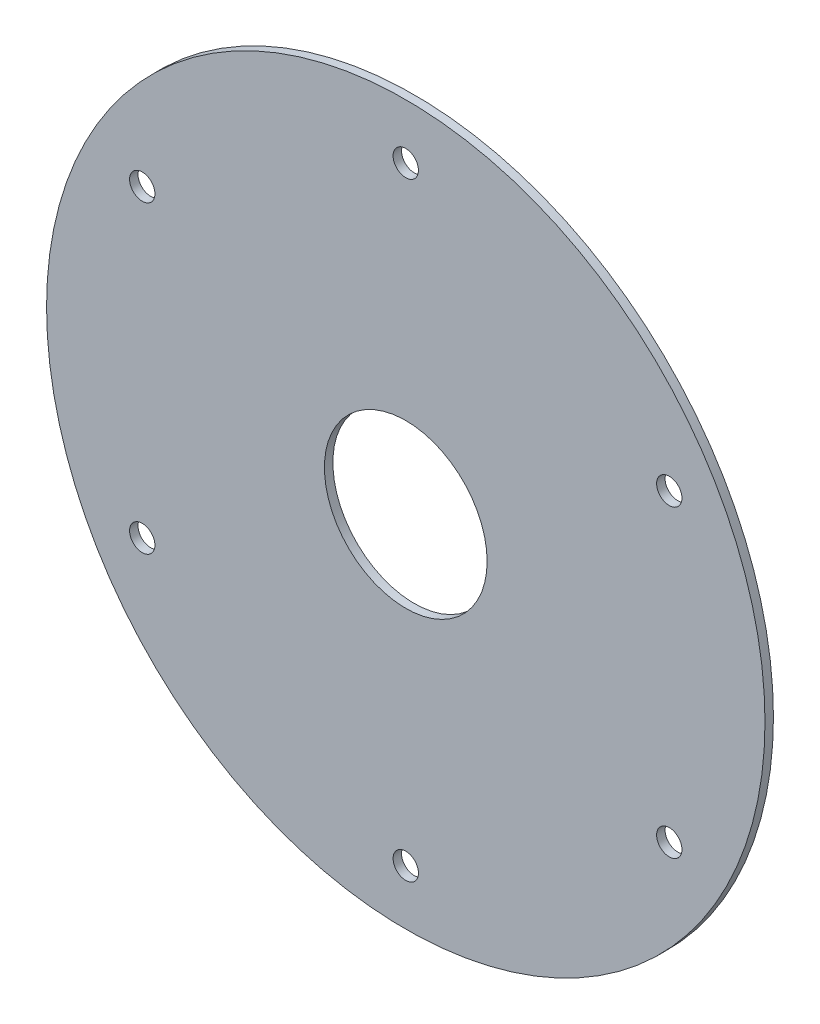
ISO-10303-21;
HEADER;
FILE_DESCRIPTION(('STEP AP214'),'2;1');
FILE_NAME('part.step','',(''),(''),'','','');
FILE_SCHEMA(('AUTOMOTIVE_DESIGN { 1 0 10303 214 1 1 1 1 }'));
ENDSEC;
DATA;
#1=APPLICATION_CONTEXT('core data for automotive mechanical design processes');
#2=APPLICATION_PROTOCOL_DEFINITION('international standard','automotive_design',2000,#1);
#3=PRODUCT_CONTEXT('',#1,'mechanical');
#4=PRODUCT('Part','Part','',(#3));
#5=PRODUCT_RELATED_PRODUCT_CATEGORY('part','',(#4));
#6=PRODUCT_DEFINITION_FORMATION('','',#4);
#7=PRODUCT_DEFINITION_CONTEXT('part definition',#1,'design');
#8=PRODUCT_DEFINITION('design','',#6,#7);
#9=PRODUCT_DEFINITION_SHAPE('','',#8);
#10=(LENGTH_UNIT() NAMED_UNIT(*) SI_UNIT(.MILLI.,.METRE.));
#11=(NAMED_UNIT(*) PLANE_ANGLE_UNIT() SI_UNIT($,.RADIAN.));
#12=(NAMED_UNIT(*) SI_UNIT($,.STERADIAN.) SOLID_ANGLE_UNIT());
#13=UNCERTAINTY_MEASURE_WITH_UNIT(LENGTH_MEASURE(1.E-05),#10,'distance_accuracy_value','');
#14=(GEOMETRIC_REPRESENTATION_CONTEXT(3) GLOBAL_UNCERTAINTY_ASSIGNED_CONTEXT((#13)) GLOBAL_UNIT_ASSIGNED_CONTEXT((#10,
#11,#12)) REPRESENTATION_CONTEXT('',''));
#15=CARTESIAN_POINT('',(0.,0.,0.));
#16=DIRECTION('',(0.,0.,1.));
#17=DIRECTION('',(1.,0.,0.));
#18=AXIS2_PLACEMENT_3D('',#15,#16,#17);
#19=CARTESIAN_POINT('',(0.,0.,4.));
#20=DIRECTION('',(0.,0.,1.));
#21=DIRECTION('',(1.,0.,0.));
#22=AXIS2_PLACEMENT_3D('',#19,#20,#21);
#23=PLANE('',#22);
#24=CARTESIAN_POINT('',(-124.707658144959,-72.0000000000001,4.));
#25=DIRECTION('',(0.,0.,1.));
#26=DIRECTION('',(1.,0.,0.));
#27=AXIS2_PLACEMENT_3D('',#24,#25,#26);
#28=CIRCLE('',#27,5.99999999999999);
#29=CARTESIAN_POINT('',(-118.707658144959,-72.0000000000001,4.));
#30=VERTEX_POINT('',#29);
#31=EDGE_CURVE('E99',#30,#30,#28,.T.);
#32=ORIENTED_EDGE('',*,*,#31,.F.);
#33=EDGE_LOOP('',(#32));
#34=FACE_BOUND('',#33,.T.);
#35=CARTESIAN_POINT('',(124.707658144959,-72.,4.));
#36=DIRECTION('',(0.,0.,1.));
#37=DIRECTION('',(1.,0.,0.));
#38=AXIS2_PLACEMENT_3D('',#35,#36,#37);
#39=CIRCLE('',#38,5.99999999999999);
#40=CARTESIAN_POINT('',(130.707658144959,-72.,4.));
#41=VERTEX_POINT('',#40);
#42=EDGE_CURVE('E83',#41,#41,#39,.T.);
#43=ORIENTED_EDGE('',*,*,#42,.F.);
#44=EDGE_LOOP('',(#43));
#45=FACE_BOUND('',#44,.T.);
#46=CARTESIAN_POINT('',(0.,144.,4.));
#47=DIRECTION('',(0.,0.,1.));
#48=DIRECTION('',(1.,0.,0.));
#49=AXIS2_PLACEMENT_3D('',#46,#47,#48);
#50=CIRCLE('',#49,6.);
#51=CARTESIAN_POINT('',(6.,144.,4.));
#52=VERTEX_POINT('',#51);
#53=EDGE_CURVE('E67',#52,#52,#50,.T.);
#54=ORIENTED_EDGE('',*,*,#53,.F.);
#55=EDGE_LOOP('',(#54));
#56=FACE_BOUND('',#55,.T.);
#57=CARTESIAN_POINT('',(0.,0.,4.));
#58=DIRECTION('',(0.,0.,1.));
#59=DIRECTION('',(1.,0.,0.));
#60=AXIS2_PLACEMENT_3D('',#57,#58,#59);
#61=CIRCLE('',#60,170.);
#62=CARTESIAN_POINT('',(170.,0.,4.));
#63=VERTEX_POINT('',#62);
#64=EDGE_CURVE('E10',#63,#63,#61,.T.);
#65=ORIENTED_EDGE('',*,*,#64,.T.);
#66=EDGE_LOOP('',(#65));
#67=FACE_BOUND('',#66,.T.);
#68=CARTESIAN_POINT('',(0.,0.,4.));
#69=DIRECTION('',(0.,0.,1.));
#70=DIRECTION('',(1.,0.,0.));
#71=AXIS2_PLACEMENT_3D('',#68,#69,#70);
#72=CIRCLE('',#71,38.5);
#73=CARTESIAN_POINT('',(38.5,0.,4.));
#74=VERTEX_POINT('',#73);
#75=EDGE_CURVE('E61',#74,#74,#72,.T.);
#76=ORIENTED_EDGE('',*,*,#75,.F.);
#77=EDGE_LOOP('',(#76));
#78=FACE_BOUND('',#77,.T.);
#79=CARTESIAN_POINT('',(124.707658144959,72.,4.));
#80=DIRECTION('',(0.,0.,1.));
#81=DIRECTION('',(1.,0.,0.));
#82=AXIS2_PLACEMENT_3D('',#79,#80,#81);
#83=CIRCLE('',#82,5.99999999999999);
#84=CARTESIAN_POINT('',(130.707658144959,72.,4.));
#85=VERTEX_POINT('',#84);
#86=EDGE_CURVE('E75',#85,#85,#83,.T.);
#87=ORIENTED_EDGE('',*,*,#86,.F.);
#88=EDGE_LOOP('',(#87));
#89=FACE_BOUND('',#88,.T.);
#90=CARTESIAN_POINT('',(0.,-144.,4.));
#91=DIRECTION('',(0.,0.,1.));
#92=DIRECTION('',(1.,0.,0.));
#93=AXIS2_PLACEMENT_3D('',#90,#91,#92);
#94=CIRCLE('',#93,6.);
#95=CARTESIAN_POINT('',(6.00000000000002,-144.,4.));
#96=VERTEX_POINT('',#95);
#97=EDGE_CURVE('E91',#96,#96,#94,.T.);
#98=ORIENTED_EDGE('',*,*,#97,.F.);
#99=EDGE_LOOP('',(#98));
#100=FACE_BOUND('',#99,.T.);
#101=CARTESIAN_POINT('',(-124.707658144959,71.9999999999999,4.));
#102=DIRECTION('',(0.,0.,1.));
#103=DIRECTION('',(1.,0.,0.));
#104=AXIS2_PLACEMENT_3D('',#101,#102,#103);
#105=CIRCLE('',#104,5.99999999999999);
#106=CARTESIAN_POINT('',(-118.707658144959,71.9999999999999,4.));
#107=VERTEX_POINT('',#106);
#108=EDGE_CURVE('E107',#107,#107,#105,.T.);
#109=ORIENTED_EDGE('',*,*,#108,.F.);
#110=EDGE_LOOP('',(#109));
#111=FACE_BOUND('',#110,.T.);
#112=ADVANCED_FACE('F47',(#34,#45,#56,#67,#78,#89,#100,#111),#23,.T.);
#113=CARTESIAN_POINT('',(0.,0.,0.));
#114=DIRECTION('',(0.,0.,1.));
#115=DIRECTION('',(1.,0.,0.));
#116=AXIS2_PLACEMENT_3D('',#113,#114,#115);
#117=PLANE('',#116);
#118=CARTESIAN_POINT('',(0.,0.,0.));
#119=DIRECTION('',(0.,0.,1.));
#120=DIRECTION('',(1.,0.,0.));
#121=AXIS2_PLACEMENT_3D('',#118,#119,#120);
#122=CIRCLE('',#121,170.);
#123=CARTESIAN_POINT('',(170.,0.,0.));
#124=VERTEX_POINT('',#123);
#125=EDGE_CURVE('E51',#124,#124,#122,.T.);
#126=ORIENTED_EDGE('',*,*,#125,.F.);
#127=EDGE_LOOP('',(#126));
#128=FACE_BOUND('',#127,.T.);
#129=CARTESIAN_POINT('',(0.,0.,0.));
#130=DIRECTION('',(0.,0.,1.));
#131=DIRECTION('',(1.,0.,0.));
#132=AXIS2_PLACEMENT_3D('',#129,#130,#131);
#133=CIRCLE('',#132,38.5);
#134=CARTESIAN_POINT('',(38.5,0.,0.));
#135=VERTEX_POINT('',#134);
#136=EDGE_CURVE('E63',#135,#135,#133,.T.);
#137=ORIENTED_EDGE('',*,*,#136,.T.);
#138=EDGE_LOOP('',(#137));
#139=FACE_BOUND('',#138,.T.);
#140=CARTESIAN_POINT('',(0.,144.,0.));
#141=DIRECTION('',(0.,0.,1.));
#142=DIRECTION('',(1.,0.,0.));
#143=AXIS2_PLACEMENT_3D('',#140,#141,#142);
#144=CIRCLE('',#143,6.);
#145=CARTESIAN_POINT('',(6.,144.,0.));
#146=VERTEX_POINT('',#145);
#147=EDGE_CURVE('E71',#146,#146,#144,.T.);
#148=ORIENTED_EDGE('',*,*,#147,.T.);
#149=EDGE_LOOP('',(#148));
#150=FACE_BOUND('',#149,.T.);
#151=CARTESIAN_POINT('',(124.707658144959,72.,0.));
#152=DIRECTION('',(0.,0.,1.));
#153=DIRECTION('',(1.,0.,0.));
#154=AXIS2_PLACEMENT_3D('',#151,#152,#153);
#155=CIRCLE('',#154,5.99999999999999);
#156=CARTESIAN_POINT('',(130.707658144959,72.,0.));
#157=VERTEX_POINT('',#156);
#158=EDGE_CURVE('E79',#157,#157,#155,.T.);
#159=ORIENTED_EDGE('',*,*,#158,.T.);
#160=EDGE_LOOP('',(#159));
#161=FACE_BOUND('',#160,.T.);
#162=CARTESIAN_POINT('',(124.707658144959,-72.,0.));
#163=DIRECTION('',(0.,0.,1.));
#164=DIRECTION('',(1.,0.,0.));
#165=AXIS2_PLACEMENT_3D('',#162,#163,#164);
#166=CIRCLE('',#165,5.99999999999999);
#167=CARTESIAN_POINT('',(130.707658144959,-72.,0.));
#168=VERTEX_POINT('',#167);
#169=EDGE_CURVE('E87',#168,#168,#166,.T.);
#170=ORIENTED_EDGE('',*,*,#169,.T.);
#171=EDGE_LOOP('',(#170));
#172=FACE_BOUND('',#171,.T.);
#173=CARTESIAN_POINT('',(0.,-144.,0.));
#174=DIRECTION('',(0.,0.,1.));
#175=DIRECTION('',(1.,0.,0.));
#176=AXIS2_PLACEMENT_3D('',#173,#174,#175);
#177=CIRCLE('',#176,6.);
#178=CARTESIAN_POINT('',(6.00000000000002,-144.,0.));
#179=VERTEX_POINT('',#178);
#180=EDGE_CURVE('E95',#179,#179,#177,.T.);
#181=ORIENTED_EDGE('',*,*,#180,.T.);
#182=EDGE_LOOP('',(#181));
#183=FACE_BOUND('',#182,.T.);
#184=CARTESIAN_POINT('',(-124.707658144959,-72.0000000000001,0.));
#185=DIRECTION('',(0.,0.,1.));
#186=DIRECTION('',(1.,0.,0.));
#187=AXIS2_PLACEMENT_3D('',#184,#185,#186);
#188=CIRCLE('',#187,5.99999999999999);
#189=CARTESIAN_POINT('',(-118.707658144959,-72.0000000000001,0.));
#190=VERTEX_POINT('',#189);
#191=EDGE_CURVE('E103',#190,#190,#188,.T.);
#192=ORIENTED_EDGE('',*,*,#191,.T.);
#193=EDGE_LOOP('',(#192));
#194=FACE_BOUND('',#193,.T.);
#195=CARTESIAN_POINT('',(-124.707658144959,71.9999999999999,0.));
#196=DIRECTION('',(0.,0.,1.));
#197=DIRECTION('',(1.,0.,0.));
#198=AXIS2_PLACEMENT_3D('',#195,#196,#197);
#199=CIRCLE('',#198,5.99999999999999);
#200=CARTESIAN_POINT('',(-118.707658144959,71.9999999999999,0.));
#201=VERTEX_POINT('',#200);
#202=EDGE_CURVE('E111',#201,#201,#199,.T.);
#203=ORIENTED_EDGE('',*,*,#202,.T.);
#204=EDGE_LOOP('',(#203));
#205=FACE_BOUND('',#204,.T.);
#206=ADVANCED_FACE('F124',(#128,#139,#150,#161,#172,#183,#194,#205),#117,.F.);
#207=CARTESIAN_POINT('',(0.,0.,4.));
#208=DIRECTION('',(0.,0.,-1.));
#209=DIRECTION('',(-1.,0.,0.));
#210=AXIS2_PLACEMENT_3D('',#207,#208,#209);
#211=CYLINDRICAL_SURFACE('',#210,170.);
#212=ORIENTED_EDGE('',*,*,#64,.F.);
#213=EDGE_LOOP('',(#212));
#214=FACE_BOUND('',#213,.T.);
#215=ORIENTED_EDGE('',*,*,#125,.T.);
#216=EDGE_LOOP('',(#215));
#217=FACE_BOUND('',#216,.T.);
#218=ADVANCED_FACE('F49',(#214,#217),#211,.T.);
#219=CARTESIAN_POINT('',(0.,0.,4.));
#220=DIRECTION('',(0.,0.,-1.));
#221=DIRECTION('',(-1.,0.,0.));
#222=AXIS2_PLACEMENT_3D('',#219,#220,#221);
#223=CYLINDRICAL_SURFACE('',#222,38.5);
#224=ORIENTED_EDGE('',*,*,#75,.T.);
#225=EDGE_LOOP('',(#224));
#226=FACE_BOUND('',#225,.T.);
#227=ORIENTED_EDGE('',*,*,#136,.F.);
#228=EDGE_LOOP('',(#227));
#229=FACE_BOUND('',#228,.T.);
#230=ADVANCED_FACE('F134',(#226,#229),#223,.F.);
#231=CARTESIAN_POINT('',(0.,144.,4.));
#232=DIRECTION('',(0.,0.,-1.));
#233=DIRECTION('',(-1.,0.,0.));
#234=AXIS2_PLACEMENT_3D('',#231,#232,#233);
#235=CYLINDRICAL_SURFACE('',#234,6.);
#236=ORIENTED_EDGE('',*,*,#53,.T.);
#237=EDGE_LOOP('',(#236));
#238=FACE_BOUND('',#237,.T.);
#239=ORIENTED_EDGE('',*,*,#147,.F.);
#240=EDGE_LOOP('',(#239));
#241=FACE_BOUND('',#240,.T.);
#242=ADVANCED_FACE('F137',(#238,#241),#235,.F.);
#243=CARTESIAN_POINT('',(124.707658144959,72.,4.));
#244=DIRECTION('',(0.,0.,-1.));
#245=DIRECTION('',(-1.,0.,0.));
#246=AXIS2_PLACEMENT_3D('',#243,#244,#245);
#247=CYLINDRICAL_SURFACE('',#246,5.99999999999999);
#248=ORIENTED_EDGE('',*,*,#86,.T.);
#249=EDGE_LOOP('',(#248));
#250=FACE_BOUND('',#249,.T.);
#251=ORIENTED_EDGE('',*,*,#158,.F.);
#252=EDGE_LOOP('',(#251));
#253=FACE_BOUND('',#252,.T.);
#254=ADVANCED_FACE('F141',(#250,#253),#247,.F.);
#255=CARTESIAN_POINT('',(124.707658144959,-72.,4.));
#256=DIRECTION('',(0.,0.,-1.));
#257=DIRECTION('',(-1.,0.,0.));
#258=AXIS2_PLACEMENT_3D('',#255,#256,#257);
#259=CYLINDRICAL_SURFACE('',#258,5.99999999999999);
#260=ORIENTED_EDGE('',*,*,#42,.T.);
#261=EDGE_LOOP('',(#260));
#262=FACE_BOUND('',#261,.T.);
#263=ORIENTED_EDGE('',*,*,#169,.F.);
#264=EDGE_LOOP('',(#263));
#265=FACE_BOUND('',#264,.T.);
#266=ADVANCED_FACE('F145',(#262,#265),#259,.F.);
#267=CARTESIAN_POINT('',(0.,-144.,4.));
#268=DIRECTION('',(0.,0.,-1.));
#269=DIRECTION('',(-1.,0.,0.));
#270=AXIS2_PLACEMENT_3D('',#267,#268,#269);
#271=CYLINDRICAL_SURFACE('',#270,6.);
#272=ORIENTED_EDGE('',*,*,#97,.T.);
#273=EDGE_LOOP('',(#272));
#274=FACE_BOUND('',#273,.T.);
#275=ORIENTED_EDGE('',*,*,#180,.F.);
#276=EDGE_LOOP('',(#275));
#277=FACE_BOUND('',#276,.T.);
#278=ADVANCED_FACE('F149',(#274,#277),#271,.F.);
#279=CARTESIAN_POINT('',(-124.707658144959,-72.0000000000001,4.));
#280=DIRECTION('',(0.,0.,-1.));
#281=DIRECTION('',(-1.,0.,0.));
#282=AXIS2_PLACEMENT_3D('',#279,#280,#281);
#283=CYLINDRICAL_SURFACE('',#282,5.99999999999999);
#284=ORIENTED_EDGE('',*,*,#31,.T.);
#285=EDGE_LOOP('',(#284));
#286=FACE_BOUND('',#285,.T.);
#287=ORIENTED_EDGE('',*,*,#191,.F.);
#288=EDGE_LOOP('',(#287));
#289=FACE_BOUND('',#288,.T.);
#290=ADVANCED_FACE('F153',(#286,#289),#283,.F.);
#291=CARTESIAN_POINT('',(-124.707658144959,71.9999999999999,4.));
#292=DIRECTION('',(0.,0.,-1.));
#293=DIRECTION('',(-1.,0.,0.));
#294=AXIS2_PLACEMENT_3D('',#291,#292,#293);
#295=CYLINDRICAL_SURFACE('',#294,5.99999999999999);
#296=ORIENTED_EDGE('',*,*,#108,.T.);
#297=EDGE_LOOP('',(#296));
#298=FACE_BOUND('',#297,.T.);
#299=ORIENTED_EDGE('',*,*,#202,.F.);
#300=EDGE_LOOP('',(#299));
#301=FACE_BOUND('',#300,.T.);
#302=ADVANCED_FACE('F120',(#298,#301),#295,.F.);
#303=CLOSED_SHELL('',(#112,#206,#218,#230,#242,#254,#266,#278,#290,#302));
#304=MANIFOLD_SOLID_BREP('B2',#303);
#305=ADVANCED_BREP_SHAPE_REPRESENTATION('',(#18,#304),#14);
#306=SHAPE_DEFINITION_REPRESENTATION(#9,#305);
ENDSEC;
END-ISO-10303-21;
